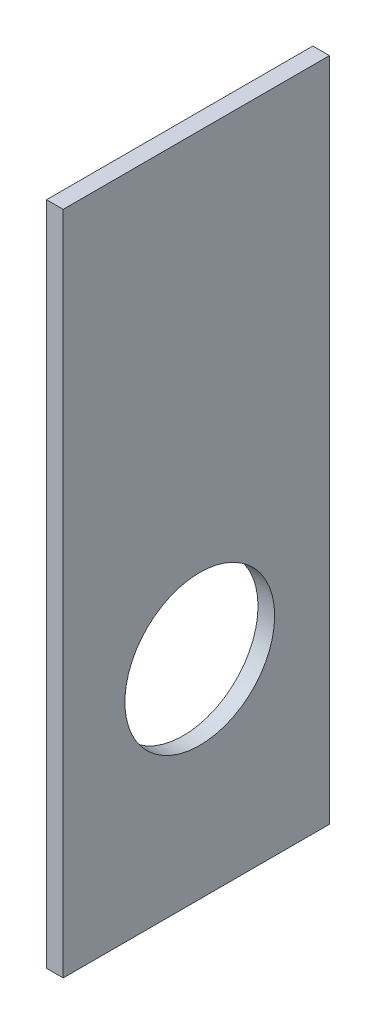
ISO-10303-21;
HEADER;
FILE_DESCRIPTION(('STEP AP214'),'2;1');
FILE_NAME('part.step','',(''),(''),'','','');
FILE_SCHEMA(('AUTOMOTIVE_DESIGN { 1 0 10303 214 1 1 1 1 }'));
ENDSEC;
DATA;
#1=APPLICATION_CONTEXT('core data for automotive mechanical design processes');
#2=APPLICATION_PROTOCOL_DEFINITION('international standard','automotive_design',2000,#1);
#3=PRODUCT_CONTEXT('',#1,'mechanical');
#4=PRODUCT('Part','Part','',(#3));
#5=PRODUCT_RELATED_PRODUCT_CATEGORY('part','',(#4));
#6=PRODUCT_DEFINITION_FORMATION('','',#4);
#7=PRODUCT_DEFINITION_CONTEXT('part definition',#1,'design');
#8=PRODUCT_DEFINITION('design','',#6,#7);
#9=PRODUCT_DEFINITION_SHAPE('','',#8);
#10=(LENGTH_UNIT() NAMED_UNIT(*) SI_UNIT(.MILLI.,.METRE.));
#11=(NAMED_UNIT(*) PLANE_ANGLE_UNIT() SI_UNIT($,.RADIAN.));
#12=(NAMED_UNIT(*) SI_UNIT($,.STERADIAN.) SOLID_ANGLE_UNIT());
#13=UNCERTAINTY_MEASURE_WITH_UNIT(LENGTH_MEASURE(1.E-05),#10,'distance_accuracy_value','');
#14=(GEOMETRIC_REPRESENTATION_CONTEXT(3) GLOBAL_UNCERTAINTY_ASSIGNED_CONTEXT((#13)) GLOBAL_UNIT_ASSIGNED_CONTEXT((#10,
#11,#12)) REPRESENTATION_CONTEXT('',''));
#15=CARTESIAN_POINT('',(0.,0.,0.));
#16=DIRECTION('',(0.,0.,1.));
#17=DIRECTION('',(1.,0.,0.));
#18=AXIS2_PLACEMENT_3D('',#15,#16,#17);
#19=CARTESIAN_POINT('',(3.175,0.,0.));
#20=DIRECTION('',(0.,0.,-1.));
#21=DIRECTION('',(-1.,0.,0.));
#22=AXIS2_PLACEMENT_3D('',#19,#20,#21);
#23=PLANE('',#22);
#24=DIRECTION('',(0.,-1.,0.));
#25=VECTOR('',#24,1.);
#26=CARTESIAN_POINT('',(0.,0.,0.));
#27=LINE('',#26,#25);
#28=CARTESIAN_POINT('',(0.,127.,0.));
#29=VERTEX_POINT('',#28);
#30=CARTESIAN_POINT('',(0.,0.,0.));
#31=VERTEX_POINT('',#30);
#32=EDGE_CURVE('E98',#29,#31,#27,.T.);
#33=ORIENTED_EDGE('',*,*,#32,.T.);
#34=DIRECTION('',(-1.,0.,0.));
#35=VECTOR('',#34,1.);
#36=CARTESIAN_POINT('',(3.175,0.,0.));
#37=LINE('',#36,#35);
#38=CARTESIAN_POINT('',(3.175,0.,0.));
#39=VERTEX_POINT('',#38);
#40=EDGE_CURVE('E11',#39,#31,#37,.T.);
#41=ORIENTED_EDGE('',*,*,#40,.F.);
#42=DIRECTION('',(0.,-1.,0.));
#43=VECTOR('',#42,1.);
#44=CARTESIAN_POINT('',(3.175,0.,0.));
#45=LINE('',#44,#43);
#46=CARTESIAN_POINT('',(3.175,127.,0.));
#47=VERTEX_POINT('',#46);
#48=EDGE_CURVE('E85',#47,#39,#45,.T.);
#49=ORIENTED_EDGE('',*,*,#48,.F.);
#50=DIRECTION('',(-1.,0.,0.));
#51=VECTOR('',#50,1.);
#52=CARTESIAN_POINT('',(3.175,127.,0.));
#53=LINE('',#52,#51);
#54=EDGE_CURVE('E94',#47,#29,#53,.T.);
#55=ORIENTED_EDGE('',*,*,#54,.T.);
#56=EDGE_LOOP('',(#33,#41,#49,#55));
#57=FACE_BOUND('',#56,.T.);
#58=ADVANCED_FACE('F33',(#57),#23,.F.);
#59=CARTESIAN_POINT('',(3.175,0.,0.));
#60=DIRECTION('',(0.,1.,0.));
#61=DIRECTION('',(0.,0.,1.));
#62=AXIS2_PLACEMENT_3D('',#59,#60,#61);
#63=PLANE('',#62);
#64=DIRECTION('',(0.,0.,-1.));
#65=VECTOR('',#64,1.);
#66=CARTESIAN_POINT('',(0.,0.,0.));
#67=LINE('',#66,#65);
#68=CARTESIAN_POINT('',(0.,0.,-50.8));
#69=VERTEX_POINT('',#68);
#70=EDGE_CURVE('E89',#31,#69,#67,.T.);
#71=ORIENTED_EDGE('',*,*,#70,.T.);
#72=DIRECTION('',(-1.,0.,0.));
#73=VECTOR('',#72,1.);
#74=CARTESIAN_POINT('',(3.175,0.,-50.8));
#75=LINE('',#74,#73);
#76=CARTESIAN_POINT('',(3.175,0.,-50.8));
#77=VERTEX_POINT('',#76);
#78=EDGE_CURVE('E42',#77,#69,#75,.T.);
#79=ORIENTED_EDGE('',*,*,#78,.F.);
#80=DIRECTION('',(0.,0.,-1.));
#81=VECTOR('',#80,1.);
#82=CARTESIAN_POINT('',(3.175,0.,0.));
#83=LINE('',#82,#81);
#84=EDGE_CURVE('E80',#39,#77,#83,.T.);
#85=ORIENTED_EDGE('',*,*,#84,.F.);
#86=ORIENTED_EDGE('',*,*,#40,.T.);
#87=EDGE_LOOP('',(#71,#79,#85,#86));
#88=FACE_BOUND('',#87,.T.);
#89=ADVANCED_FACE('F88',(#88),#63,.F.);
#90=CARTESIAN_POINT('',(3.175,0.,-50.8));
#91=DIRECTION('',(0.,0.,1.));
#92=DIRECTION('',(1.,0.,0.));
#93=AXIS2_PLACEMENT_3D('',#90,#91,#92);
#94=PLANE('',#93);
#95=DIRECTION('',(0.,1.,0.));
#96=VECTOR('',#95,1.);
#97=CARTESIAN_POINT('',(0.,0.,-50.8));
#98=LINE('',#97,#96);
#99=CARTESIAN_POINT('',(0.,127.,-50.8));
#100=VERTEX_POINT('',#99);
#101=EDGE_CURVE('E67',#69,#100,#98,.T.);
#102=ORIENTED_EDGE('',*,*,#101,.T.);
#103=DIRECTION('',(-1.,0.,0.));
#104=VECTOR('',#103,1.);
#105=CARTESIAN_POINT('',(3.175,127.,-50.8));
#106=LINE('',#105,#104);
#107=CARTESIAN_POINT('',(3.175,127.,-50.8));
#108=VERTEX_POINT('',#107);
#109=EDGE_CURVE('E90',#108,#100,#106,.T.);
#110=ORIENTED_EDGE('',*,*,#109,.F.);
#111=DIRECTION('',(0.,1.,0.));
#112=VECTOR('',#111,1.);
#113=CARTESIAN_POINT('',(3.175,0.,-50.8));
#114=LINE('',#113,#112);
#115=EDGE_CURVE('E83',#77,#108,#114,.T.);
#116=ORIENTED_EDGE('',*,*,#115,.F.);
#117=ORIENTED_EDGE('',*,*,#78,.T.);
#118=EDGE_LOOP('',(#102,#110,#116,#117));
#119=FACE_BOUND('',#118,.T.);
#120=ADVANCED_FACE('F92',(#119),#94,.F.);
#121=CARTESIAN_POINT('',(3.175,127.,0.));
#122=DIRECTION('',(0.,-1.,0.));
#123=DIRECTION('',(0.,0.,-1.));
#124=AXIS2_PLACEMENT_3D('',#121,#122,#123);
#125=PLANE('',#124);
#126=DIRECTION('',(0.,0.,1.));
#127=VECTOR('',#126,1.);
#128=CARTESIAN_POINT('',(0.,127.,0.));
#129=LINE('',#128,#127);
#130=EDGE_CURVE('E73',#100,#29,#129,.T.);
#131=ORIENTED_EDGE('',*,*,#130,.T.);
#132=ORIENTED_EDGE('',*,*,#54,.F.);
#133=DIRECTION('',(0.,0.,1.));
#134=VECTOR('',#133,1.);
#135=CARTESIAN_POINT('',(3.175,127.,0.));
#136=LINE('',#135,#134);
#137=EDGE_CURVE('E50',#108,#47,#136,.T.);
#138=ORIENTED_EDGE('',*,*,#137,.F.);
#139=ORIENTED_EDGE('',*,*,#109,.T.);
#140=EDGE_LOOP('',(#131,#132,#138,#139));
#141=FACE_BOUND('',#140,.T.);
#142=ADVANCED_FACE('F105',(#141),#125,.F.);
#143=CARTESIAN_POINT('',(3.175,0.,0.));
#144=DIRECTION('',(-1.,0.,0.));
#145=DIRECTION('',(0.,0.,1.));
#146=AXIS2_PLACEMENT_3D('',#143,#144,#145);
#147=PLANE('',#146);
#148=CARTESIAN_POINT('',(3.175,39.6875,-26.0584233861904));
#149=DIRECTION('',(1.,0.,0.));
#150=DIRECTION('',(0.,0.,-1.));
#151=AXIS2_PLACEMENT_3D('',#148,#149,#150);
#152=CIRCLE('',#151,14.2875);
#153=CARTESIAN_POINT('',(3.175,39.6875,-40.3459233861904));
#154=VERTEX_POINT('',#153);
#155=EDGE_CURVE('E111',#154,#154,#152,.T.);
#156=ORIENTED_EDGE('',*,*,#155,.F.);
#157=EDGE_LOOP('',(#156));
#158=FACE_BOUND('',#157,.T.);
#159=ORIENTED_EDGE('',*,*,#48,.T.);
#160=ORIENTED_EDGE('',*,*,#84,.T.);
#161=ORIENTED_EDGE('',*,*,#115,.T.);
#162=ORIENTED_EDGE('',*,*,#137,.T.);
#163=EDGE_LOOP('',(#159,#160,#161,#162));
#164=FACE_BOUND('',#163,.T.);
#165=ADVANCED_FACE('F81',(#158,#164),#147,.F.);
#166=CARTESIAN_POINT('',(0.,0.,0.));
#167=DIRECTION('',(-1.,0.,0.));
#168=DIRECTION('',(0.,0.,1.));
#169=AXIS2_PLACEMENT_3D('',#166,#167,#168);
#170=PLANE('',#169);
#171=CARTESIAN_POINT('',(0.,39.6875,-26.0584233861904));
#172=DIRECTION('',(-1.,0.,0.));
#173=DIRECTION('',(0.,0.,1.));
#174=AXIS2_PLACEMENT_3D('',#171,#172,#173);
#175=CIRCLE('',#174,14.2875);
#176=CARTESIAN_POINT('',(0.,39.6875,-40.3459233861904));
#177=VERTEX_POINT('',#176);
#178=EDGE_CURVE('E36',#177,#177,#175,.T.);
#179=ORIENTED_EDGE('',*,*,#178,.F.);
#180=EDGE_LOOP('',(#179));
#181=FACE_BOUND('',#180,.T.);
#182=ORIENTED_EDGE('',*,*,#32,.F.);
#183=ORIENTED_EDGE('',*,*,#130,.F.);
#184=ORIENTED_EDGE('',*,*,#101,.F.);
#185=ORIENTED_EDGE('',*,*,#70,.F.);
#186=EDGE_LOOP('',(#182,#183,#184,#185));
#187=FACE_BOUND('',#186,.T.);
#188=ADVANCED_FACE('F108',(#181,#187),#170,.T.);
#189=CARTESIAN_POINT('',(-6.35,39.6875,-26.0584233861904));
#190=DIRECTION('',(1.,0.,0.));
#191=DIRECTION('',(0.,0.,-1.));
#192=AXIS2_PLACEMENT_3D('',#189,#190,#191);
#193=CYLINDRICAL_SURFACE('',#192,14.2875);
#194=CARTESIAN_POINT('',(0.,39.6875,-40.3459233861904));
#195=CARTESIAN_POINT('',(0.0330729166666668,39.6875,-40.3459233861904));
#196=CARTESIAN_POINT('',(0.0661458333333336,39.6875,-40.3459233861904));
#197=CARTESIAN_POINT('',(0.132291666666667,39.6875,-40.3459233861904));
#198=CARTESIAN_POINT('',(0.165364583333333,39.6875,-40.3459233861904));
#199=CARTESIAN_POINT('',(0.231510416666667,39.6875,-40.3459233861904));
#200=CARTESIAN_POINT('',(0.264583333333333,39.6875,-40.3459233861904));
#201=CARTESIAN_POINT('',(0.330729166666667,39.6875,-40.3459233861904));
#202=CARTESIAN_POINT('',(0.363802083333333,39.6875,-40.3459233861904));
#203=CARTESIAN_POINT('',(0.429947916666666,39.6875,-40.3459233861904));
#204=CARTESIAN_POINT('',(0.463020833333333,39.6875,-40.3459233861904));
#205=CARTESIAN_POINT('',(0.529166666666667,39.6875,-40.3459233861904));
#206=CARTESIAN_POINT('',(0.562239583333334,39.6875,-40.3459233861904));
#207=CARTESIAN_POINT('',(0.628385416666667,39.6875,-40.3459233861904));
#208=CARTESIAN_POINT('',(0.661458333333333,39.6875,-40.3459233861904));
#209=CARTESIAN_POINT('',(0.727604166666667,39.6875,-40.3459233861904));
#210=CARTESIAN_POINT('',(0.760677083333334,39.6875,-40.3459233861904));
#211=CARTESIAN_POINT('',(0.826822916666667,39.6875,-40.3459233861904));
#212=CARTESIAN_POINT('',(0.859895833333334,39.6875,-40.3459233861904));
#213=CARTESIAN_POINT('',(0.926041666666667,39.6875,-40.3459233861904));
#214=CARTESIAN_POINT('',(0.959114583333334,39.6875,-40.3459233861904));
#215=CARTESIAN_POINT('',(1.02526041666667,39.6875,-40.3459233861904));
#216=CARTESIAN_POINT('',(1.05833333333333,39.6875,-40.3459233861904));
#217=CARTESIAN_POINT('',(1.12447916666667,39.6875,-40.3459233861904));
#218=CARTESIAN_POINT('',(1.15755208333333,39.6875,-40.3459233861904));
#219=CARTESIAN_POINT('',(1.22369791666667,39.6875,-40.3459233861904));
#220=CARTESIAN_POINT('',(1.25677083333333,39.6875,-40.3459233861904));
#221=CARTESIAN_POINT('',(1.32291666666667,39.6875,-40.3459233861904));
#222=CARTESIAN_POINT('',(1.35598958333333,39.6875,-40.3459233861904));
#223=CARTESIAN_POINT('',(1.42213541666667,39.6875,-40.3459233861904));
#224=CARTESIAN_POINT('',(1.45520833333333,39.6875,-40.3459233861904));
#225=CARTESIAN_POINT('',(1.52135416666667,39.6875,-40.3459233861904));
#226=CARTESIAN_POINT('',(1.55442708333333,39.6875,-40.3459233861904));
#227=CARTESIAN_POINT('',(1.62057291666667,39.6875,-40.3459233861904));
#228=CARTESIAN_POINT('',(1.65364583333333,39.6875,-40.3459233861904));
#229=CARTESIAN_POINT('',(1.71979166666667,39.6875,-40.3459233861904));
#230=CARTESIAN_POINT('',(1.75286458333333,39.6875,-40.3459233861904));
#231=CARTESIAN_POINT('',(1.81901041666667,39.6875,-40.3459233861904));
#232=CARTESIAN_POINT('',(1.85208333333333,39.6875,-40.3459233861904));
#233=CARTESIAN_POINT('',(1.91822916666667,39.6875,-40.3459233861904));
#234=CARTESIAN_POINT('',(1.95130208333333,39.6875,-40.3459233861904));
#235=CARTESIAN_POINT('',(2.01744791666667,39.6875,-40.3459233861904));
#236=CARTESIAN_POINT('',(2.05052083333333,39.6875,-40.3459233861904));
#237=CARTESIAN_POINT('',(2.11666666666667,39.6875,-40.3459233861904));
#238=CARTESIAN_POINT('',(2.14973958333333,39.6875,-40.3459233861904));
#239=CARTESIAN_POINT('',(2.21588541666667,39.6875,-40.3459233861904));
#240=CARTESIAN_POINT('',(2.24895833333333,39.6875,-40.3459233861904));
#241=CARTESIAN_POINT('',(2.31510416666667,39.6875,-40.3459233861904));
#242=CARTESIAN_POINT('',(2.34817708333333,39.6875,-40.3459233861904));
#243=CARTESIAN_POINT('',(2.41432291666667,39.6875,-40.3459233861904));
#244=CARTESIAN_POINT('',(2.44739583333333,39.6875,-40.3459233861904));
#245=CARTESIAN_POINT('',(2.51354166666667,39.6875,-40.3459233861904));
#246=CARTESIAN_POINT('',(2.54661458333333,39.6875,-40.3459233861904));
#247=CARTESIAN_POINT('',(2.61276041666667,39.6875,-40.3459233861904));
#248=CARTESIAN_POINT('',(2.64583333333333,39.6875,-40.3459233861904));
#249=CARTESIAN_POINT('',(2.71197916666667,39.6875,-40.3459233861904));
#250=CARTESIAN_POINT('',(2.74505208333333,39.6875,-40.3459233861904));
#251=CARTESIAN_POINT('',(2.81119791666667,39.6875,-40.3459233861904));
#252=CARTESIAN_POINT('',(2.84427083333333,39.6875,-40.3459233861904));
#253=CARTESIAN_POINT('',(2.91041666666667,39.6875,-40.3459233861904));
#254=CARTESIAN_POINT('',(2.94348958333333,39.6875,-40.3459233861904));
#255=CARTESIAN_POINT('',(3.00963541666667,39.6875,-40.3459233861904));
#256=CARTESIAN_POINT('',(3.04270833333333,39.6875,-40.3459233861904));
#257=CARTESIAN_POINT('',(3.10885416666667,39.6875,-40.3459233861904));
#258=CARTESIAN_POINT('',(3.14192708333333,39.6875,-40.3459233861904));
#259=CARTESIAN_POINT('',(3.175,39.6875,-40.3459233861904));
#260=B_SPLINE_CURVE_WITH_KNOTS('',3,(#194,#195,#196,#197,#198,#199,#200,#201,#202,#203,#204,
#205,#206,#207,#208,#209,#210,#211,#212,#213,#214,#215,#216,#217,#218,#219,#220,#221,#222,#223,
#224,#225,#226,#227,#228,#229,#230,#231,#232,#233,#234,#235,#236,#237,#238,#239,#240,#241,#242,
#243,#244,#245,#246,#247,#248,#249,#250,#251,#252,#253,#254,#255,#256,#257,#258,#259),
.UNSPECIFIED.,.F.,.F.,(4,2,2,2,2,2,2,2,2,2,2,2,2,2,2,2,2,2,2,2,2,2,2,2,2,2,2,2,2,2,2,2,4),(0.,
0.0992187500000004,0.1984375,0.29765625,0.396875,0.49609375,0.5953125,0.69453125,0.79375,
0.892968750000001,0.9921875,1.09140625,1.190625,1.28984375,1.3890625,1.48828125,1.5875,
1.68671875,1.7859375,1.88515625,1.984375,2.08359375,2.1828125,2.28203125,2.38125,2.48046875,
2.5796875,2.67890625,2.778125,2.87734375,2.9765625,3.07578125,3.175),.UNSPECIFIED.);
#261=EDGE_CURVE('BSEAM118',#177,#154,#260,.T.);
#262=ORIENTED_EDGE('',*,*,#178,.T.);
#263=ORIENTED_EDGE('',*,*,#155,.T.);
#264=ORIENTED_EDGE('',*,*,#261,.T.);
#265=ORIENTED_EDGE('',*,*,#261,.F.);
#266=EDGE_LOOP('',(#262,#264,#263,#265));
#267=FACE_BOUND('',#266,.T.);
#268=ADVANCED_FACE('F118',(#267),#193,.F.);
#269=CLOSED_SHELL('',(#58,#89,#120,#142,#165,#188,#268));
#270=MANIFOLD_SOLID_BREP('B2',#269);
#271=ADVANCED_BREP_SHAPE_REPRESENTATION('',(#18,#270),#14);
#272=SHAPE_DEFINITION_REPRESENTATION(#9,#271);
ENDSEC;
END-ISO-10303-21;
